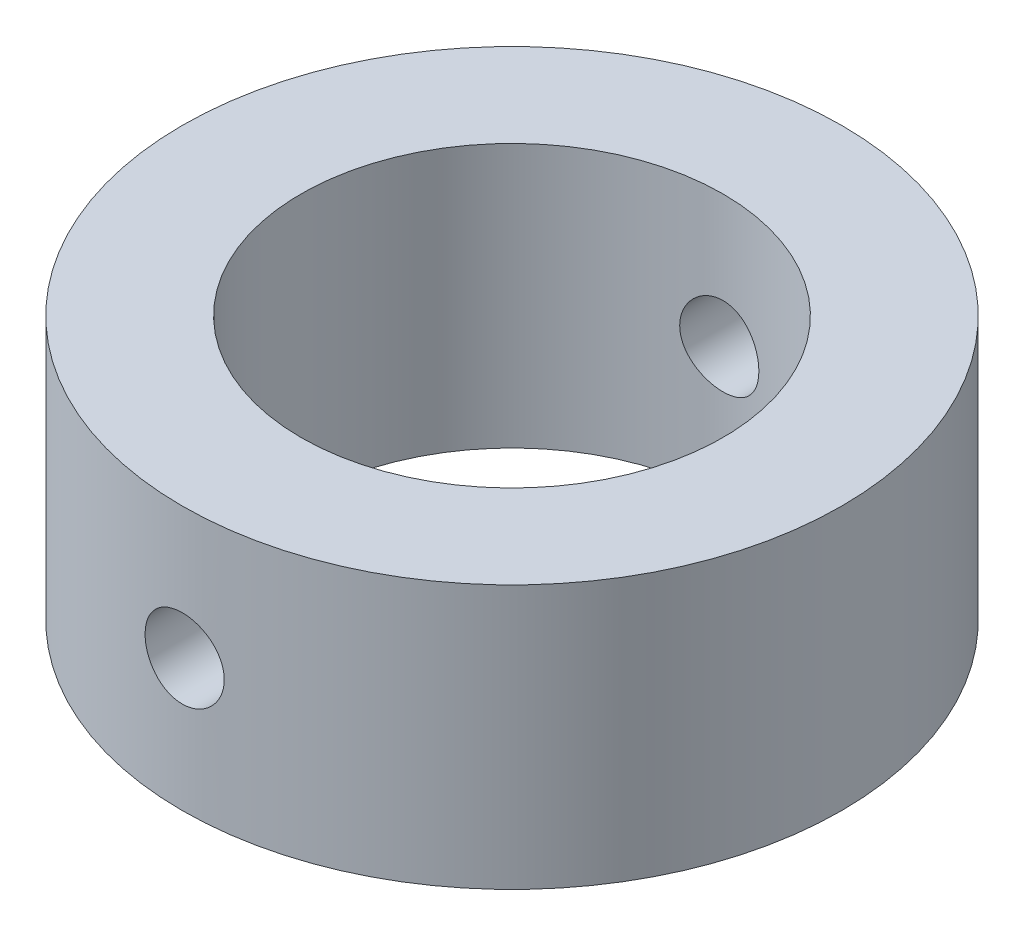
ISO-10303-21;
HEADER;
FILE_DESCRIPTION(('STEP AP214'),'2;1');
FILE_NAME('part.step','',(''),(''),'','','');
FILE_SCHEMA(('AUTOMOTIVE_DESIGN { 1 0 10303 214 1 1 1 1 }'));
ENDSEC;
DATA;
#1=APPLICATION_CONTEXT('core data for automotive mechanical design processes');
#2=APPLICATION_PROTOCOL_DEFINITION('international standard','automotive_design',2000,#1);
#3=PRODUCT_CONTEXT('',#1,'mechanical');
#4=PRODUCT('Part','Part','',(#3));
#5=PRODUCT_RELATED_PRODUCT_CATEGORY('part','',(#4));
#6=PRODUCT_DEFINITION_FORMATION('','',#4);
#7=PRODUCT_DEFINITION_CONTEXT('part definition',#1,'design');
#8=PRODUCT_DEFINITION('design','',#6,#7);
#9=PRODUCT_DEFINITION_SHAPE('','',#8);
#10=(LENGTH_UNIT() NAMED_UNIT(*) SI_UNIT(.MILLI.,.METRE.));
#11=(NAMED_UNIT(*) PLANE_ANGLE_UNIT() SI_UNIT($,.RADIAN.));
#12=(NAMED_UNIT(*) SI_UNIT($,.STERADIAN.) SOLID_ANGLE_UNIT());
#13=UNCERTAINTY_MEASURE_WITH_UNIT(LENGTH_MEASURE(1.E-05),#10,'distance_accuracy_value','');
#14=(GEOMETRIC_REPRESENTATION_CONTEXT(3) GLOBAL_UNCERTAINTY_ASSIGNED_CONTEXT((#13)) GLOBAL_UNIT_ASSIGNED_CONTEXT((#10,
#11,#12)) REPRESENTATION_CONTEXT('',''));
#15=CARTESIAN_POINT('',(0.,0.,0.));
#16=DIRECTION('',(0.,0.,1.));
#17=DIRECTION('',(1.,0.,0.));
#18=AXIS2_PLACEMENT_3D('',#15,#16,#17);
#19=CARTESIAN_POINT('',(-1.04083408558608E-13,10.0000000000001,1.66533453693773E-13));
#20=DIRECTION('',(0.,0.999999999999993,0.));
#21=DIRECTION('',(0.,0.,0.99999999999999));
#22=AXIS2_PLACEMENT_3D('',#19,#20,#21);
#23=PLANE('',#22);
#24=CARTESIAN_POINT('',(-1.04083408558608E-13,10.0000000000001,1.66533453693773E-13));
#25=DIRECTION('',(0.,0.999999999999993,0.));
#26=DIRECTION('',(0.,0.,0.99999999999999));
#27=AXIS2_PLACEMENT_3D('',#24,#25,#26);
#28=CIRCLE('',#27,12.5);
#29=CARTESIAN_POINT('',(-1.30451205393457E-13,10.0000000000001,12.5));
#30=VERTEX_POINT('',#29);
#31=EDGE_CURVE('E10',#30,#30,#28,.T.);
#32=ORIENTED_EDGE('',*,*,#31,.T.);
#33=EDGE_LOOP('',(#32));
#34=FACE_BOUND('',#33,.T.);
#35=CARTESIAN_POINT('',(-1.04083408558608E-13,10.0000000000001,1.66533453693773E-13));
#36=DIRECTION('',(0.,0.999999999999993,0.));
#37=DIRECTION('',(0.,0.,0.99999999999999));
#38=AXIS2_PLACEMENT_3D('',#35,#36,#37);
#39=CIRCLE('',#38,8.);
#40=CARTESIAN_POINT('',(-1.20958798532911E-13,10.0000000000001,8.00000000000009));
#41=VERTEX_POINT('',#40);
#42=EDGE_CURVE('E58',#41,#41,#39,.T.);
#43=ORIENTED_EDGE('',*,*,#42,.F.);
#44=EDGE_LOOP('',(#43));
#45=FACE_BOUND('',#44,.T.);
#46=ADVANCED_FACE('F36',(#34,#45),#23,.T.);
#47=CARTESIAN_POINT('',(0.,0.,0.));
#48=DIRECTION('',(0.,0.999999999999993,0.));
#49=DIRECTION('',(0.,0.,0.99999999999999));
#50=AXIS2_PLACEMENT_3D('',#47,#48,#49);
#51=PLANE('',#50);
#52=CARTESIAN_POINT('',(0.,0.,0.));
#53=DIRECTION('',(0.,0.999999999999993,0.));
#54=DIRECTION('',(0.,0.,0.99999999999999));
#55=AXIS2_PLACEMENT_3D('',#52,#53,#54);
#56=CIRCLE('',#55,12.5);
#57=CARTESIAN_POINT('',(0.,0.,12.4999999999999));
#58=VERTEX_POINT('',#57);
#59=EDGE_CURVE('E51',#58,#58,#56,.T.);
#60=ORIENTED_EDGE('',*,*,#59,.F.);
#61=EDGE_LOOP('',(#60));
#62=FACE_BOUND('',#61,.T.);
#63=CARTESIAN_POINT('',(0.,0.,0.));
#64=DIRECTION('',(0.,0.999999999999993,0.));
#65=DIRECTION('',(0.,0.,0.99999999999999));
#66=AXIS2_PLACEMENT_3D('',#63,#64,#65);
#67=CIRCLE('',#66,8.);
#68=CARTESIAN_POINT('',(0.,0.,7.99999999999992));
#69=VERTEX_POINT('',#68);
#70=EDGE_CURVE('E61',#69,#69,#67,.T.);
#71=ORIENTED_EDGE('',*,*,#70,.T.);
#72=EDGE_LOOP('',(#71));
#73=FACE_BOUND('',#72,.T.);
#74=ADVANCED_FACE('F104',(#62,#73),#51,.F.);
#75=CARTESIAN_POINT('',(-1.04083408558608E-13,10.0000000000001,1.66533453693773E-13));
#76=DIRECTION('',(0.,-0.999999999999993,0.));
#77=DIRECTION('',(0.,0.,-0.99999999999999));
#78=AXIS2_PLACEMENT_3D('',#75,#76,#77);
#79=CYLINDRICAL_SURFACE('',#78,12.5);
#80=CARTESIAN_POINT('',(0.,6.50000000000009,-12.5000000000018));
#81=CARTESIAN_POINT('',(-0.0839320235538495,6.49999641802932,-12.4999988678754));
#82=CARTESIAN_POINT('',(-0.167917158665606,6.4929316706539,-12.4991457100209));
#83=CARTESIAN_POINT('',(-0.333552285654103,6.46485946792255,-12.4958243527102));
#84=CARTESIAN_POINT('',(-0.41519971479497,6.44383727937474,-12.4933544466863));
#85=CARTESIAN_POINT('',(-0.573737397670243,6.38847686173701,-12.4870779632715));
#86=CARTESIAN_POINT('',(-0.650630743796186,6.35414739658812,-12.4832722657653));
#87=CARTESIAN_POINT('',(-0.797549578916035,6.27316563245853,-12.474747963217));
#88=CARTESIAN_POINT('',(-0.867576283567501,6.22651552012332,-12.470029520207));
#89=CARTESIAN_POINT('',(-0.999145657672167,6.1219625690123,-12.460180052721));
#90=CARTESIAN_POINT('',(-1.06064834565362,6.06400957994413,-12.455047251545));
#91=CARTESIAN_POINT('',(-1.17307965519176,5.93860351755626,-12.4449619698575));
#92=CARTESIAN_POINT('',(-1.22400774913235,5.87114997049084,-12.4400094983536));
#93=CARTESIAN_POINT('',(-1.31399171436944,5.72839958735096,-12.4308280185201));
#94=CARTESIAN_POINT('',(-1.35301037836284,5.6530791377101,-12.4266012951978));
#95=CARTESIAN_POINT('',(-1.4178302865078,5.49689564894571,-12.4193730672347));
#96=CARTESIAN_POINT('',(-1.44363199348386,5.41603280401532,-12.4163715196921));
#97=CARTESIAN_POINT('',(-1.48116465022695,5.25147357034419,-12.4119503036888));
#98=CARTESIAN_POINT('',(-1.49296288993818,5.16779273578609,-12.410523072627));
#99=CARTESIAN_POINT('',(-1.50236187609832,4.99962753181789,-12.4093888845304));
#100=CARTESIAN_POINT('',(-1.49996315026424,4.9151431923915,-12.4096818635536));
#101=CARTESIAN_POINT('',(-1.4810915803933,4.74823701760783,-12.4119480733173));
#102=CARTESIAN_POINT('',(-1.4646927161114,4.66580668065992,-12.4139124717337));
#103=CARTESIAN_POINT('',(-1.41840173085022,4.50487648608943,-12.4192864043802));
#104=CARTESIAN_POINT('',(-1.38850935612903,4.42637670241069,-12.4226959657861));
#105=CARTESIAN_POINT('',(-1.31599990349927,4.27530526588069,-12.4305861039755));
#106=CARTESIAN_POINT('',(-1.27335053101952,4.20274926082344,-12.4350693931097));
#107=CARTESIAN_POINT('',(-1.17656086584732,4.06579639454237,-12.4445996993949));
#108=CARTESIAN_POINT('',(-1.1224200886159,4.00139987754903,-12.4496467403124));
#109=CARTESIAN_POINT('',(-1.00377377781101,3.88216445781815,-12.4597751654336));
#110=CARTESIAN_POINT('',(-0.93920445025603,3.82738901507179,-12.4648565637118));
#111=CARTESIAN_POINT('',(-0.801753979469279,3.72944423950002,-12.4744510399273));
#112=CARTESIAN_POINT('',(-0.728872819540071,3.68627492999048,-12.4789641167229));
#113=CARTESIAN_POINT('',(-0.576819654131445,3.61276835718027,-12.486915943087));
#114=CARTESIAN_POINT('',(-0.497645789357667,3.58243490333503,-12.4903543736403));
#115=CARTESIAN_POINT('',(-0.335278011136523,3.53551063107474,-12.4957665326543));
#116=CARTESIAN_POINT('',(-0.252084271220698,3.51891921999775,-12.4977403242809));
#117=CARTESIAN_POINT('',(-0.0845871981870963,3.50003187225112,-12.4999926250169));
#118=CARTESIAN_POINT('',(-0.000293860216033745,3.4976484837998,-12.5002815046874));
#119=CARTESIAN_POINT('',(0.167491034121586,3.50701428893448,-12.4991593911614));
#120=CARTESIAN_POINT('',(0.250982606163605,3.51876320564805,-12.4977484312673));
#121=CARTESIAN_POINT('',(0.414537131964059,3.55598748200185,-12.4933916690362));
#122=CARTESIAN_POINT('',(0.494609673184354,3.58142130652525,-12.4904505118952));
#123=CARTESIAN_POINT('',(0.649352698843117,3.64525035167692,-12.4833627750895));
#124=CARTESIAN_POINT('',(0.724023012961719,3.68364598074519,-12.4792161574399));
#125=CARTESIAN_POINT('',(0.866233588832485,3.77252145795133,-12.4701542579367));
#126=CARTESIAN_POINT('',(0.933738144813601,3.82305806890548,-12.465235404232));
#127=CARTESIAN_POINT('',(1.05933812576088,3.93470042320416,-12.4551908959708));
#128=CARTESIAN_POINT('',(1.11743320736474,3.99580655207409,-12.4500652338761));
#129=CARTESIAN_POINT('',(1.22287397613082,4.12723780771395,-12.440152974249));
#130=CARTESIAN_POINT('',(1.27016181615967,4.19760950767198,-12.4353682915651));
#131=CARTESIAN_POINT('',(1.3522465721466,4.34534751253788,-12.426710749669));
#132=CARTESIAN_POINT('',(1.38704372178034,4.42271368655933,-12.4228378733992));
#133=CARTESIAN_POINT('',(1.44306498334083,4.5820553044476,-12.4164552867272));
#134=CARTESIAN_POINT('',(1.46432210079679,4.6640190059299,-12.4139422637815));
#135=CARTESIAN_POINT('',(1.49276636081761,4.8303844847427,-12.4105542637291));
#136=CARTESIAN_POINT('',(1.49995410263039,4.91478615807886,-12.4096792168571));
#137=CARTESIAN_POINT('',(1.50004516908967,5.08305636481882,-12.4096681633052));
#138=CARTESIAN_POINT('',(1.49303936835686,5.16692486288588,-12.4105210931969));
#139=CARTESIAN_POINT('',(1.46513424336047,5.3322833931972,-12.4138461473711));
#140=CARTESIAN_POINT('',(1.44423491411019,5.41377342458777,-12.4163182722349));
#141=CARTESIAN_POINT('',(1.38916369910263,5.57205226944435,-12.4225998262314));
#142=CARTESIAN_POINT('',(1.35499582785283,5.64884249674793,-12.4264088508405));
#143=CARTESIAN_POINT('',(1.27436641314018,5.79561387353507,-12.4349357269567));
#144=CARTESIAN_POINT('',(1.22790476354712,5.86559496422934,-12.4396535863095));
#145=CARTESIAN_POINT('',(1.12366844823588,5.99722647005418,-12.4495027561313));
#146=CARTESIAN_POINT('',(1.06582601965079,6.05882305163331,-12.4546364290672));
#147=CARTESIAN_POINT('',(0.940610466672322,6.17147123978333,-12.4647177484083));
#148=CARTESIAN_POINT('',(0.873235091317956,6.22252034881466,-12.4696653505274));
#149=CARTESIAN_POINT('',(0.730596612325557,6.31277528899947,-12.4788360854681));
#150=CARTESIAN_POINT('',(0.655306617312025,6.35193886286143,-12.4830566108101));
#151=CARTESIAN_POINT('',(0.499211375842686,6.41701188222156,-12.4902709259863));
#152=CARTESIAN_POINT('',(0.418412282181131,6.44293584809021,-12.4932660590333));
#153=CARTESIAN_POINT('',(0.280988550618414,6.47453171016915,-12.4969634163016));
#154=CARTESIAN_POINT('',(0.225233284876788,6.48406874194343,-12.4980966397164));
#155=CARTESIAN_POINT('',(0.112993367846865,6.49680407174574,-12.49961531021));
#156=CARTESIAN_POINT('',(0.056508721376824,6.50000241162534,-12.500000762226));
#157=CARTESIAN_POINT('',(0.,6.50000000000009,-12.5000000000018));
#158=B_SPLINE_CURVE_WITH_KNOTS('',3,(#80,#81,#82,#83,#84,#85,#86,#87,#88,#89,#90,#91,#92,#93,
#94,#95,#96,#97,#98,#99,#100,#101,#102,#103,#104,#105,#106,#107,#108,#109,#110,#111,#112,#113,
#114,#115,#116,#117,#118,#119,#120,#121,#122,#123,#124,#125,#126,#127,#128,#129,#130,#131,#132,
#133,#134,#135,#136,#137,#138,#139,#140,#141,#142,#143,#144,#145,#146,#147,#148,#149,#150,#151,
#152,#153,#154,#155,#156,#157),.UNSPECIFIED.,.T.,.F.,(4,2,2,2,2,2,2,2,2,2,2,2,2,2,2,2,2,2,2,2,2,
2,2,2,2,2,2,2,2,2,2,2,2,2,2,2,2,2,4),(0.,0.251589675478079,0.503445347043127,0.755135431877836,
1.00678087720853,1.2595693609794,1.51237045452435,1.76595344748199,2.01952755999568,
2.27187819171652,2.5242194433425,2.77523546456126,3.02625620626687,3.27791786855247,
3.52959014434599,3.78286472320138,4.03613981086292,4.28949001347135,4.54282928911307,
4.79460761312097,5.04638100450514,5.29739451278848,5.54841593150804,5.80063460892752,
6.05286248801754,6.30641037908336,6.55995352653133,6.81287624132431,7.06578818330759,
7.31708596596127,7.56838383881143,7.81960573856905,8.07082980715561,8.32359762010131,
8.57642521760032,8.83014145119706,9.08357882396342,9.25296714728106,9.4223543521988),.UNSPECIFIED.);
#159=CARTESIAN_POINT('',(0.,6.50000000000009,-12.5000000000018));
#160=VERTEX_POINT('',#159);
#161=EDGE_CURVE('E88',#160,#160,#158,.T.);
#162=ORIENTED_EDGE('',*,*,#161,.T.);
#163=EDGE_LOOP('',(#162));
#164=FACE_BOUND('',#163,.T.);
#165=CARTESIAN_POINT('',(1.50000000000006,5.00000000000009,12.4096736459892));
#166=CARTESIAN_POINT('',(1.49999641586394,4.91607042940492,12.4096748089146));
#167=CARTESIAN_POINT('',(1.49293206748169,4.83208773993942,12.4105342894215));
#168=CARTESIAN_POINT('',(1.46486159354815,4.66645769398428,12.4138782255219));
#169=CARTESIAN_POINT('',(1.44384072619505,4.58481290215947,12.4163643992966));
#170=CARTESIAN_POINT('',(1.38848417307913,4.42628079724312,12.4226761552602));
#171=CARTESIAN_POINT('',(1.35415731394867,4.34939036943203,12.4265008493682));
#172=CARTESIAN_POINT('',(1.27318168778968,4.20247642894961,12.4350576249846));
#173=CARTESIAN_POINT('',(1.22653510106011,4.13245170421595,12.4397895458948));
#174=CARTESIAN_POINT('',(1.12198571965025,4.0008801141949,12.4496550027306));
#175=CARTESIAN_POINT('',(1.06403198625324,3.9393738528259,12.4547902908256));
#176=CARTESIAN_POINT('',(0.938622932174377,3.82693564091924,12.464868079273));
#177=CARTESIAN_POINT('',(0.871167147527077,3.77600420702907,12.4698105701965));
#178=CARTESIAN_POINT('',(0.728414784233972,3.68601673353183,12.4789637011512));
#179=CARTESIAN_POINT('',(0.653094976924423,3.64699729213037,12.4831720690335));
#180=CARTESIAN_POINT('',(0.496912883636252,3.58217576980777,12.4903635621622));
#181=CARTESIAN_POINT('',(0.416050788042627,3.55637323512599,12.4933467294714));
#182=CARTESIAN_POINT('',(0.251493928492412,3.51883887194812,12.4977393662243));
#183=CARTESIAN_POINT('',(0.167814735521584,3.50703967327722,12.4991563682205));
#184=CARTESIAN_POINT('',(-0.000347248334331914,3.49763820034505,12.5002827183053));
#185=CARTESIAN_POINT('',(-0.0848300098341872,3.50003540892113,12.4999921286));
#186=CARTESIAN_POINT('',(-0.251742833758763,3.51890456092592,12.4977421462616));
#187=CARTESIAN_POINT('',(-0.334181218784117,3.5353040524865,12.4957913442172));
#188=CARTESIAN_POINT('',(-0.495127185045601,3.58159907585812,12.4904498211192));
#189=CARTESIAN_POINT('',(-0.573634696521306,3.61149484709069,12.4870590745213));
#190=CARTESIAN_POINT('',(-0.72471556162969,3.68401136445315,12.4792038952258));
#191=CARTESIAN_POINT('',(-0.797273648637696,3.72666361800339,12.4747368094348));
#192=CARTESIAN_POINT('',(-0.934229460099449,3.82345944947836,12.4652290483582));
#193=CARTESIAN_POINT('',(-0.998626839383552,3.87760351320792,12.4601883488279));
#194=CARTESIAN_POINT('',(-1.11785860561538,3.99625217477035,12.4500603372629));
#195=CARTESIAN_POINT('',(-1.172630194392,4.06081989068703,12.4449729316273));
#196=CARTESIAN_POINT('',(-1.27056795912582,4.19826575684009,12.4353563023039));
#197=CARTESIAN_POINT('',(-1.31373410365261,4.27114392958246,12.4308270801279));
#198=CARTESIAN_POINT('',(-1.38723839179319,4.42319624507382,12.422839602759));
#199=CARTESIAN_POINT('',(-1.41757175578817,4.5023727206291,12.4193817467285));
#200=CARTESIAN_POINT('',(-1.46449505016186,4.66474617975066,12.4139364153308));
#201=CARTESIAN_POINT('',(-1.48108558929271,4.74794298505963,12.4119488748347));
#202=CARTESIAN_POINT('',(-1.49996964356079,4.91544154818827,12.40968100078));
#203=CARTESIAN_POINT('',(-1.50235142135385,4.99973321794054,12.4093901280319));
#204=CARTESIAN_POINT('',(-1.49298299027804,5.16751439042155,12.4105206650575));
#205=CARTESIAN_POINT('',(-1.48123305845627,5.25100390884385,12.4119420412631));
#206=CARTESIAN_POINT('',(-1.44400895971016,5.41454789179911,12.416327313747));
#207=CARTESIAN_POINT('',(-1.41857731249481,5.49461217340467,12.4192864301081));
#208=CARTESIAN_POINT('',(-1.3547553839632,5.64933964148787,12.4264098926626));
#209=CARTESIAN_POINT('',(-1.31636468129306,5.7240026522514,12.4305742780438));
#210=CARTESIAN_POINT('',(-1.22749651360817,5.86620814748724,12.439664365663));
#211=CARTESIAN_POINT('',(-1.17696103570768,5.93371414344063,12.4445936804929));
#212=CARTESIAN_POINT('',(-1.06532008918371,6.0593175565058,12.4546467770187));
#213=CARTESIAN_POINT('',(-1.00421424221797,6.11741463670272,12.4597705656702));
#214=CARTESIAN_POINT('',(-0.872782136333698,6.22285987361733,12.4696675472438));
#215=CARTESIAN_POINT('',(-0.802409249709031,6.27015012325581,12.4744387628018));
#216=CARTESIAN_POINT('',(-0.654668214705499,6.35223910466468,12.4830636215581));
#217=CARTESIAN_POINT('',(-0.577300197822235,6.38703807118715,12.4869172819999));
#218=CARTESIAN_POINT('',(-0.417959622359981,6.44306050243785,12.4932640215237));
#219=CARTESIAN_POINT('',(-0.335999085323722,6.4643177599423,12.4957604851316));
#220=CARTESIAN_POINT('',(-0.169640292495984,6.49276337179126,12.4991255682256));
#221=CARTESIAN_POINT('',(-0.0852421377308463,6.49995230834652,12.4999942550765));
#222=CARTESIAN_POINT('',(0.0830300031277086,6.50004692205612,12.5000056524305));
#223=CARTESIAN_POINT('',(0.166903952329381,6.49304201834179,12.4991591682626));
#224=CARTESIAN_POINT('',(0.332273612398077,6.46513677254902,12.4958567701037));
#225=CARTESIAN_POINT('',(0.413769324044653,6.44423643502536,12.4934008566403));
#226=CARTESIAN_POINT('',(0.572059777991787,6.38916099243426,12.4871544009726));
#227=CARTESIAN_POINT('',(0.6488559043741,6.35498981777288,12.4833642539576));
#228=CARTESIAN_POINT('',(0.795637705262751,6.27435196520798,12.4748696221582));
#229=CARTESIAN_POINT('',(0.865623324646819,6.22788518779874,12.4701651299743));
#230=CARTESIAN_POINT('',(0.997254742124278,6.12364315899698,12.4603319681114));
#231=CARTESIAN_POINT('',(1.05884763393853,6.06580132233719,12.4552009088048));
#232=CARTESIAN_POINT('',(1.17148865356219,5.94058848142383,12.4451123432296));
#233=CARTESIAN_POINT('',(1.22253427406546,5.8732152177494,12.4401548784602));
#234=CARTESIAN_POINT('',(1.31278537364371,5.73057853191479,12.4309559603744));
#235=CARTESIAN_POINT('',(1.35194799100162,5.65528783586351,12.4267171228207));
#236=CARTESIAN_POINT('',(1.41701902911882,5.49919112312463,12.4194661188371));
#237=CARTESIAN_POINT('',(1.44294198213019,5.41839126440121,12.4164526081959));
#238=CARTESIAN_POINT('',(1.47453505036821,5.28097023044741,12.412731361848));
#239=CARTESIAN_POINT('',(1.48407082470974,5.22521862402013,12.4115903654977));
#240=CARTESIAN_POINT('',(1.49680448454759,5.11298603393293,12.4100611186529));
#241=CARTESIAN_POINT('',(1.50000241299714,5.05650505521877,12.409672863057));
#242=CARTESIAN_POINT('',(1.50000000000006,5.00000000000009,12.4096736459892));
#243=B_SPLINE_CURVE_WITH_KNOTS('',3,(#165,#166,#167,#168,#169,#170,#171,#172,#173,#174,#175,
#176,#177,#178,#179,#180,#181,#182,#183,#184,#185,#186,#187,#188,#189,#190,#191,#192,#193,#194,
#195,#196,#197,#198,#199,#200,#201,#202,#203,#204,#205,#206,#207,#208,#209,#210,#211,#212,#213,
#214,#215,#216,#217,#218,#219,#220,#221,#222,#223,#224,#225,#226,#227,#228,#229,#230,#231,#232,
#233,#234,#235,#236,#237,#238,#239,#240,#241,#242),.UNSPECIFIED.,.T.,.F.,(4,2,2,2,2,2,2,2,2,2,2,
2,2,2,2,2,2,2,2,2,2,2,2,2,2,2,2,2,2,2,2,2,2,2,2,2,2,2,4),(0.,0.251582306609632,
0.503430774819373,0.755112462522309,1.00674963836111,1.25954776660375,1.5123582427361,
1.76593780876781,2.01950866836467,2.2718545860806,2.52419131111314,2.77523023079343,
3.02627360403326,3.27794222677638,3.52962149067936,3.78288622204437,4.03615163930568,
4.28951130338287,4.54285974404059,4.79463277043138,5.04640086098251,5.29739099483089,
5.54838929021994,5.80061125155285,6.05284224246455,6.30639464647625,6.55994228515902,
6.81285470170465,7.06575665136901,7.3170703093906,7.56838388503431,7.81962308616492,
8.07086432058371,8.32362252061908,8.57644073759121,8.83016031080827,9.08360079205962,
9.25297814464871,9.42235434931907),.UNSPECIFIED.);
#244=CARTESIAN_POINT('',(1.50000000000006,5.00000000000009,12.4096736459892));
#245=VERTEX_POINT('',#244);
#246=EDGE_CURVE('E82',#245,#245,#243,.T.);
#247=ORIENTED_EDGE('',*,*,#246,.T.);
#248=EDGE_LOOP('',(#247));
#249=FACE_BOUND('',#248,.T.);
#250=ORIENTED_EDGE('',*,*,#31,.F.);
#251=EDGE_LOOP('',(#250));
#252=FACE_BOUND('',#251,.T.);
#253=ORIENTED_EDGE('',*,*,#59,.T.);
#254=EDGE_LOOP('',(#253));
#255=FACE_BOUND('',#254,.T.);
#256=ADVANCED_FACE('F38',(#164,#249,#252,#255),#79,.T.);
#257=CARTESIAN_POINT('',(-1.04083408558608E-13,10.0000000000001,1.66533453693773E-13));
#258=DIRECTION('',(0.,-0.999999999999993,0.));
#259=DIRECTION('',(0.,0.,-0.99999999999999));
#260=AXIS2_PLACEMENT_3D('',#257,#258,#259);
#261=CYLINDRICAL_SURFACE('',#260,8.);
#262=CARTESIAN_POINT('',(-2.70616862252382E-13,6.5000000000002,-8.00000000000201));
#263=CARTESIAN_POINT('',(-0.0834717464656961,6.49999681041186,-7.99999848834102));
#264=CARTESIAN_POINT('',(-0.166984992730275,6.4930089233808,-7.9986800992176));
#265=CARTESIAN_POINT('',(-0.331658129841939,6.46526000488189,-7.99354785890439));
#266=CARTESIAN_POINT('',(-0.412815974152381,6.44448734936052,-7.98973190166893));
#267=CARTESIAN_POINT('',(-0.570372961851933,6.38982729874088,-7.98003138765489));
#268=CARTESIAN_POINT('',(-0.646776330685438,6.35595174754763,-7.97414869946471));
#269=CARTESIAN_POINT('',(-0.79280797309411,6.27608112307734,-7.9609571059976));
#270=CARTESIAN_POINT('',(-0.862436794477473,6.23008703085537,-7.95364831618298));
#271=CARTESIAN_POINT('',(-0.993783715930614,6.12670023199653,-7.93831336430516));
#272=CARTESIAN_POINT('',(-1.05540895503186,6.06919055533006,-7.93028034856335));
#273=CARTESIAN_POINT('',(-1.16819606135364,5.94465669091266,-7.91445318458634));
#274=CARTESIAN_POINT('',(-1.21935717689236,5.87763182023096,-7.9066590535454));
#275=CARTESIAN_POINT('',(-1.31014998665789,5.73531391163632,-7.89212551244996));
#276=CARTESIAN_POINT('',(-1.34968721969603,5.65995962968306,-7.88539493886121));
#277=CARTESIAN_POINT('',(-1.41550524332276,5.5035310848234,-7.87384713212018));
#278=CARTESIAN_POINT('',(-1.44178717713086,5.42245731588886,-7.86902973397137));
#279=CARTESIAN_POINT('',(-1.48005053503488,5.25788476908561,-7.86192269574697));
#280=CARTESIAN_POINT('',(-1.49219390192032,5.17442490279662,-7.85960445366385));
#281=CARTESIAN_POINT('',(-1.50233808095345,5.00662261519193,-7.8576719715275));
#282=CARTESIAN_POINT('',(-1.50034016135372,4.9222802736979,-7.85805748898924));
#283=CARTESIAN_POINT('',(-1.48238979602356,4.75628047473411,-7.86146292701911));
#284=CARTESIAN_POINT('',(-1.46662149996034,4.67460228569993,-7.86444808147315));
#285=CARTESIAN_POINT('',(-1.421867993962,4.51507158021748,-7.87266183284657));
#286=CARTESIAN_POINT('',(-1.39288222239501,4.43721922649085,-7.87789052509693));
#287=CARTESIAN_POINT('',(-1.32233647179297,4.28701132099987,-7.89003855292764));
#288=CARTESIAN_POINT('',(-1.2807021353244,4.21469152941924,-7.89696783823351));
#289=CARTESIAN_POINT('',(-1.18609368930399,4.07799527145986,-7.91172971602905));
#290=CARTESIAN_POINT('',(-1.13311842889261,4.01361961228541,-7.91956240015702));
#291=CARTESIAN_POINT('',(-1.01633905685291,3.8935750443278,-7.93540001272347));
#292=CARTESIAN_POINT('',(-0.952377436860469,3.83805934754843,-7.94340571024019));
#293=CARTESIAN_POINT('',(-0.81596803709865,3.73852275932469,-7.95857386108301));
#294=CARTESIAN_POINT('',(-0.743520172255776,3.69450198312968,-7.96573630595417));
#295=CARTESIAN_POINT('',(-0.592034988874744,3.61918224613014,-7.97842539677678));
#296=CARTESIAN_POINT('',(-0.512989564446457,3.58789922088231,-7.98394999136266));
#297=CARTESIAN_POINT('',(-0.350639115398641,3.53909790690812,-7.99272505402708));
#298=CARTESIAN_POINT('',(-0.267334544277825,3.52157815595496,-7.99597576368186));
#299=CARTESIAN_POINT('',(-0.100148652903495,3.50101396898203,-7.99980360642163));
#300=CARTESIAN_POINT('',(-0.0162940126342229,3.49775960847053,-8.00041950912255));
#301=CARTESIAN_POINT('',(0.150761248092176,3.50525547954787,-7.99901543598216));
#302=CARTESIAN_POINT('',(0.233961900480436,3.51600502306548,-7.99699558964636));
#303=CARTESIAN_POINT('',(0.396681573218192,3.55102903518357,-7.99057111500609));
#304=CARTESIAN_POINT('',(0.476224261045907,3.57519728253799,-7.98618522374017));
#305=CARTESIAN_POINT('',(0.63012863182449,3.63625770677894,-7.97551842212477));
#306=CARTESIAN_POINT('',(0.704489962595104,3.67315074756594,-7.96923738311522));
#307=CARTESIAN_POINT('',(0.846816671513194,3.75907812815959,-7.95538030357858));
#308=CARTESIAN_POINT('',(0.91470327701493,3.80824073853685,-7.94779086174545));
#309=CARTESIAN_POINT('',(1.04133832326434,3.91713813736241,-7.93219343489696));
#310=CARTESIAN_POINT('',(1.10008590976081,3.97687391300149,-7.92418541084883));
#311=CARTESIAN_POINT('',(1.20757295872052,4.10617231891158,-7.90852475697651));
#312=CARTESIAN_POINT('',(1.25616916218574,4.17585490812544,-7.90087825860244));
#313=CARTESIAN_POINT('',(1.34096675057781,4.32251762452388,-7.88692985578507));
#314=CARTESIAN_POINT('',(1.37716859613922,4.39949748037078,-7.88062790137524));
#315=CARTESIAN_POINT('',(1.43594673512827,4.55820586724287,-7.87013024209749));
#316=CARTESIAN_POINT('',(1.45858868794794,4.63990937955952,-7.86592440436856));
#317=CARTESIAN_POINT('',(1.48980679326232,4.80604722252144,-7.86007203802397));
#318=CARTESIAN_POINT('',(1.49838453270689,4.89048124397045,-7.85842522065974));
#319=CARTESIAN_POINT('',(1.50117762148338,5.05824833144168,-7.85789199804035));
#320=CARTESIAN_POINT('',(1.49561895003497,5.14157758095726,-7.8589621597427));
#321=CARTESIAN_POINT('',(1.47079175378812,5.30609142204564,-7.8636460065998));
#322=CARTESIAN_POINT('',(1.45152331089338,5.38727602642777,-7.86725967655935));
#323=CARTESIAN_POINT('',(1.3999188758326,5.5450744847959,-7.87660508023371));
#324=CARTESIAN_POINT('',(1.36760735397246,5.6216965913463,-7.88233284594954));
#325=CARTESIAN_POINT('',(1.29085868912194,5.7684682542413,-7.89526387551816));
#326=CARTESIAN_POINT('',(1.24642068948176,5.83861735284505,-7.90246724360284));
#327=CARTESIAN_POINT('',(1.14589487339524,5.97158368004255,-7.91767266107912));
#328=CARTESIAN_POINT('',(1.08964259864289,6.03427541256753,-7.92568505353017));
#329=CARTESIAN_POINT('',(0.967427926742208,6.14940516246488,-7.94152833918726));
#330=CARTESIAN_POINT('',(0.901463301891618,6.20184082098024,-7.94935919027529));
#331=CARTESIAN_POINT('',(0.760984945071901,6.29541095262715,-7.96403975968244));
#332=CARTESIAN_POINT('',(0.68639959064048,6.33643942849096,-7.97088000990537));
#333=CARTESIAN_POINT('',(0.531290113653747,6.4053176366054,-7.98271619380675));
#334=CARTESIAN_POINT('',(0.450771651705174,6.43317974704687,-7.98771385879257));
#335=CARTESIAN_POINT('',(0.308347202825029,6.46927731441869,-7.99428290707785));
#336=CARTESIAN_POINT('',(0.247273810251694,6.48077863031302,-7.99641470878186));
#337=CARTESIAN_POINT('',(0.124141247114915,6.49614106211678,-7.99927379953996));
#338=CARTESIAN_POINT('',(0.0620821016524517,6.50000237225615,-8.00000112429968));
#339=CARTESIAN_POINT('',(-2.70616862252382E-13,6.5000000000002,-8.00000000000201));
#340=B_SPLINE_CURVE_WITH_KNOTS('',3,(#262,#263,#264,#265,#266,#267,#268,#269,#270,#271,#272,
#273,#274,#275,#276,#277,#278,#279,#280,#281,#282,#283,#284,#285,#286,#287,#288,#289,#290,#291,
#292,#293,#294,#295,#296,#297,#298,#299,#300,#301,#302,#303,#304,#305,#306,#307,#308,#309,#310,
#311,#312,#313,#314,#315,#316,#317,#318,#319,#320,#321,#322,#323,#324,#325,#326,#327,#328,#329,
#330,#331,#332,#333,#334,#335,#336,#337,#338,#339),.UNSPECIFIED.,.T.,.F.,(4,2,2,2,2,2,2,2,2,2,2,
2,2,2,2,2,2,2,2,2,2,2,2,2,2,2,2,2,2,2,2,2,2,2,2,2,2,2,4),(0.,0.250188200964838,
0.500587642535328,0.750761271230806,1.00091465336881,1.2537511801361,1.50660586283584,
1.76146190504331,2.01629596311931,2.26818151445315,2.52004447587229,2.76859000612744,
3.0171460984677,3.26719262629511,3.51726454049839,3.77127768464055,4.02529337544922,
4.27962588321664,4.53393136673704,4.78448174076058,5.03501980464546,5.28360233907785,
5.53220175337982,5.78351778017657,6.03485728413047,6.28953436987262,6.54420198954921,
6.7976262781852,7.05102196946462,7.30039252231721,7.54976158541498,7.7986649620768,
8.04758592655409,8.30023369966359,8.55293951262223,8.80792048916282,9.06266126931146,
9.24874344524393,9.43482089039532),.UNSPECIFIED.);
#341=CARTESIAN_POINT('',(-2.70616862252382E-13,6.5000000000002,-8.00000000000201));
#342=VERTEX_POINT('',#341);
#343=EDGE_CURVE('E41',#342,#342,#340,.T.);
#344=ORIENTED_EDGE('',*,*,#343,.F.);
#345=EDGE_LOOP('',(#344));
#346=FACE_BOUND('',#345,.T.);
#347=CARTESIAN_POINT('',(1.50000000000005,5.00000000000021,7.85811682274917));
#348=CARTESIAN_POINT('',(1.4999967988325,4.91654279198849,7.8581184379329));
#349=CARTESIAN_POINT('',(1.49301126348937,4.83304405178186,7.85946079760271));
#350=CARTESIAN_POINT('',(1.46527253251806,4.66840103841825,7.86467851014391));
#351=CARTESIAN_POINT('',(1.44450765768481,4.58725882357257,7.86855601173046));
#352=CARTESIAN_POINT('',(1.38987035617788,4.42973492862916,7.87838976464723));
#353=CARTESIAN_POINT('',(1.35601013954367,4.35334889069286,7.88434407906019));
#354=CARTESIAN_POINT('',(1.27617565760357,4.20734644071315,7.89765826320972));
#355=CARTESIAN_POINT('',(1.23020233759191,4.13772950099637,7.90501802325444));
#356=CARTESIAN_POINT('',(1.12683678942623,4.0063698008006,7.92041614838766));
#357=CARTESIAN_POINT('',(1.06932292933091,3.94472351652835,7.92846116625696));
#358=CARTESIAN_POINT('',(0.944771778803501,3.83189561040072,7.9442645766405));
#359=CARTESIAN_POINT('',(0.877733863624869,3.78071467557534,7.95202295030974));
#360=CARTESIAN_POINT('',(0.735403894570142,3.68990062339961,7.96645017828222));
#361=CARTESIAN_POINT('',(0.660052840033919,3.65035846648084,7.97311028052374));
#362=CARTESIAN_POINT('',(0.503631283250847,3.58453045772669,7.98451608632953));
#363=CARTESIAN_POINT('',(0.422561251859548,3.55824351600983,7.98926194728173));
#364=CARTESIAN_POINT('',(0.258002746187436,3.51997045138891,7.99625755123619));
#365=CARTESIAN_POINT('',(0.174553323244897,3.50782169407752,7.99853565976349));
#366=CARTESIAN_POINT('',(0.0067716760354291,3.49766311229983,8.00043684615607));
#367=CARTESIAN_POINT('',(-0.0775604724476374,3.49965208386104,8.00006015010519));
#368=CARTESIAN_POINT('',(-0.243598357899399,3.51758777114727,7.9967163376307));
#369=CARTESIAN_POINT('',(-0.325323760451493,3.53335936943028,7.99378172247234));
#370=CARTESIAN_POINT('',(-0.484947165715469,3.57813564939541,7.98568826333578));
#371=CARTESIAN_POINT('',(-0.562845028826483,3.60714081334572,7.98052933829786));
#372=CARTESIAN_POINT('',(-0.713110065751473,3.67772773105821,7.96851260297161));
#373=CARTESIAN_POINT('',(-0.785443571838542,3.71937948791267,7.96164537590846));
#374=CARTESIAN_POINT('',(-0.922159977214636,3.81402566907744,7.94697147542866));
#375=CARTESIAN_POINT('',(-0.986542066910713,3.86702124688772,7.93916470650977));
#376=CARTESIAN_POINT('',(-1.10656561896894,3.98381570298366,7.92333513680375));
#377=CARTESIAN_POINT('',(-1.16205790757037,4.04776778390235,7.91531085901634));
#378=CARTESIAN_POINT('',(-1.26155171851263,4.1841495312788,7.90006508924647));
#379=CARTESIAN_POINT('',(-1.30555307271185,4.25657932176456,7.89284360901186));
#380=CARTESIAN_POINT('',(-1.38085852224477,4.40805827070249,7.88001893306954));
#381=CARTESIAN_POINT('',(-1.41214093645416,4.48711845719061,7.87441850530284));
#382=CARTESIAN_POINT('',(-1.46093656975046,4.64950118412324,7.86551242396709));
#383=CARTESIAN_POINT('',(-1.47845134901098,4.73282324046475,7.86220651038447));
#384=CARTESIAN_POINT('',(-1.49899672649734,4.9000193288558,7.85831520300836));
#385=CARTESIAN_POINT('',(-1.50224164285858,4.98386611556547,7.85768955816156));
#386=CARTESIAN_POINT('',(-1.49472968881725,5.15090345508717,7.8591219142086));
#387=CARTESIAN_POINT('',(-1.4839735108643,5.23409404014815,7.86117978238441));
#388=CARTESIAN_POINT('',(-1.44894868195885,5.3967529030544,7.86770980063038));
#389=CARTESIAN_POINT('',(-1.42479238584,5.4762462526248,7.872161866909));
#390=CARTESIAN_POINT('',(-1.36377224379073,5.63005718973005,7.88296134156631));
#391=CARTESIAN_POINT('',(-1.32690746128802,5.70437439531531,7.88930888963096));
#392=CARTESIAN_POINT('',(-1.24102353119677,5.84666761904314,7.90327577863498));
#393=CARTESIAN_POINT('',(-1.19186899639653,5.91456053786594,7.91090895425328));
#394=CARTESIAN_POINT('',(-1.08298344344277,6.04121204021414,7.92654811368117));
#395=CARTESIAN_POINT('',(-1.02325147433097,6.09996980155562,7.93455413096313));
#396=CARTESIAN_POINT('',(-0.89394941787054,6.20748376353409,7.95016624005763));
#397=CARTESIAN_POINT('',(-0.824258534096244,6.256095826606,7.95776555833322));
#398=CARTESIAN_POINT('',(-0.677574523040448,6.34092120617767,7.97159404810364));
#399=CARTESIAN_POINT('',(-0.60058167703859,6.37713500002491,7.97782327234534));
#400=CARTESIAN_POINT('',(-0.441877541578631,6.43592009786405,7.98818057995661));
#401=CARTESIAN_POINT('',(-0.360193213079067,6.45856218756156,7.9923195473016));
#402=CARTESIAN_POINT('',(-0.194096227381727,6.48978704829013,7.99807642083762));
#403=CARTESIAN_POINT('',(-0.109683858215952,6.49837129866287,7.99969459229744));
#404=CARTESIAN_POINT('',(0.058090760250525,6.50118530151861,8.00022227515255));
#405=CARTESIAN_POINT('',(0.141449307066347,6.49563275312977,7.99917286625048));
#406=CARTESIAN_POINT('',(0.306023369279272,6.47080757223174,7.99456866611721));
#407=CARTESIAN_POINT('',(0.387238905213694,6.45153507125582,7.99101389890488));
#408=CARTESIAN_POINT('',(0.545106475595573,6.39990879261624,7.98179837977858));
#409=CARTESIAN_POINT('',(0.621766319318467,6.36757818711904,7.97614135981586));
#410=CARTESIAN_POINT('',(0.768605631316915,6.29077954634498,7.9633337206879));
#411=CARTESIAN_POINT('',(0.838784665003315,6.24631069789354,7.95618300146315));
#412=CARTESIAN_POINT('',(0.971755027780027,6.14574854555784,7.9410477985977));
#413=CARTESIAN_POINT('',(1.0344262353907,6.08949796613838,7.93305284591291));
#414=CARTESIAN_POINT('',(1.14951536065498,5.96729543750735,7.91719633538843));
#415=CARTESIAN_POINT('',(1.20193086324773,5.90134120962639,7.90933480936575));
#416=CARTESIAN_POINT('',(1.29547633945375,5.76087354529673,7.89455577425741));
#417=CARTESIAN_POINT('',(1.33649740531879,5.68628656033236,7.88764767280751));
#418=CARTESIAN_POINT('',(1.4053613242343,5.53117421002027,7.87567084650038));
#419=CARTESIAN_POINT('',(1.43321661638915,5.45065453341071,7.87060038648897));
#420=CARTESIAN_POINT('',(1.46929726596173,5.30824771193421,7.8639301629197));
#421=CARTESIAN_POINT('',(1.48079105739851,5.24719427623815,7.86176310717944));
#422=CARTESIAN_POINT('',(1.49614351076219,5.12410153157981,7.85885585595523));
#423=CARTESIAN_POINT('',(1.50000238052132,5.06206224949984,7.8581156216314));
#424=CARTESIAN_POINT('',(1.50000000000005,5.00000000000021,7.85811682274917));
#425=B_SPLINE_CURVE_WITH_KNOTS('',3,(#347,#348,#349,#350,#351,#352,#353,#354,#355,#356,#357,
#358,#359,#360,#361,#362,#363,#364,#365,#366,#367,#368,#369,#370,#371,#372,#373,#374,#375,#376,
#377,#378,#379,#380,#381,#382,#383,#384,#385,#386,#387,#388,#389,#390,#391,#392,#393,#394,#395,
#396,#397,#398,#399,#400,#401,#402,#403,#404,#405,#406,#407,#408,#409,#410,#411,#412,#413,#414,
#415,#416,#417,#418,#419,#420,#421,#422,#423,#424),.UNSPECIFIED.,.T.,.F.,(4,2,2,2,2,2,2,2,2,2,2,
2,2,2,2,2,2,2,2,2,2,2,2,2,2,2,2,2,2,2,2,2,2,2,2,2,2,2,4),(0.,0.250144505793221,0.50050130238049,
0.750625227978706,1.00072963993949,1.2536233569871,1.50653367069318,1.76137104348055,
2.01618745939647,2.26804275460268,2.5198766020066,2.76855650598734,3.01724547328426,
3.26733691984227,3.51745380911805,3.77140614764073,4.02536220192392,4.27974936118257,
4.5341076886648,4.78463248587071,5.03514489338717,5.28358792315357,5.53204926624297,
5.7833786265412,6.03473059394649,6.28944125495853,6.54414210821701,6.79750269418684,
7.05083661667332,7.3002930057015,7.54974700322193,7.79876026530381,8.04779021357126,
8.3003846400876,8.55303847730783,8.80803001818137,9.06278015749137,9.24880307527225,
9.43482092920428),.UNSPECIFIED.);
#426=CARTESIAN_POINT('',(1.50000000000005,5.00000000000021,7.85811682274917));
#427=VERTEX_POINT('',#426);
#428=EDGE_CURVE('E63',#427,#427,#425,.T.);
#429=ORIENTED_EDGE('',*,*,#428,.F.);
#430=EDGE_LOOP('',(#429));
#431=FACE_BOUND('',#430,.T.);
#432=ORIENTED_EDGE('',*,*,#42,.T.);
#433=EDGE_LOOP('',(#432));
#434=FACE_BOUND('',#433,.T.);
#435=ORIENTED_EDGE('',*,*,#70,.F.);
#436=EDGE_LOOP('',(#435));
#437=FACE_BOUND('',#436,.T.);
#438=ADVANCED_FACE('F69',(#346,#431,#434,#437),#261,.F.);
#439=CARTESIAN_POINT('',(0.,5.00000000000025,-12.500000000002));
#440=DIRECTION('',(0.,0.,0.99999999999999));
#441=DIRECTION('',(0.999999999999997,0.,0.));
#442=AXIS2_PLACEMENT_3D('',#439,#440,#441);
#443=CYLINDRICAL_SURFACE('',#442,1.5);
#444=ORIENTED_EDGE('',*,*,#428,.T.);
#445=EDGE_LOOP('',(#444));
#446=FACE_BOUND('',#445,.T.);
#447=ORIENTED_EDGE('',*,*,#246,.F.);
#448=EDGE_LOOP('',(#447));
#449=FACE_BOUND('',#448,.T.);
#450=ADVANCED_FACE('F75',(#446,#449),#443,.F.);
#451=ORIENTED_EDGE('',*,*,#343,.T.);
#452=EDGE_LOOP('',(#451));
#453=FACE_BOUND('',#452,.T.);
#454=ORIENTED_EDGE('',*,*,#161,.F.);
#455=EDGE_LOOP('',(#454));
#456=FACE_BOUND('',#455,.T.);
#457=ADVANCED_FACE('F72',(#453,#456),#443,.F.);
#458=CLOSED_SHELL('',(#46,#74,#256,#438,#450,#457));
#459=MANIFOLD_SOLID_BREP('B2',#458);
#460=ADVANCED_BREP_SHAPE_REPRESENTATION('',(#18,#459),#14);
#461=SHAPE_DEFINITION_REPRESENTATION(#9,#460);
ENDSEC;
END-ISO-10303-21;
